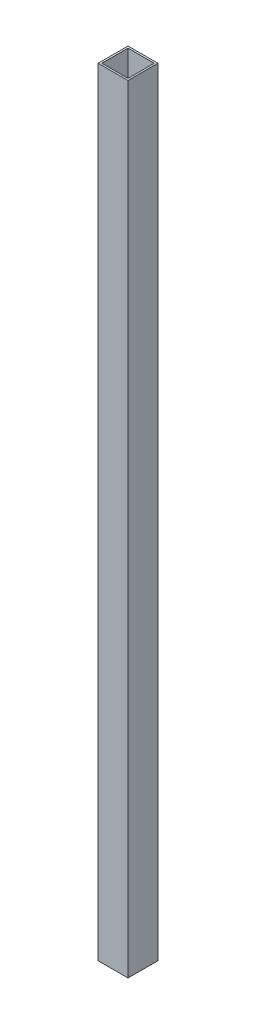
ISO-10303-21;
HEADER;
FILE_DESCRIPTION(('STEP AP214'),'2;1');
FILE_NAME('part.step','',(''),(''),'','','');
FILE_SCHEMA(('AUTOMOTIVE_DESIGN { 1 0 10303 214 1 1 1 1 }'));
ENDSEC;
DATA;
#1=APPLICATION_CONTEXT('core data for automotive mechanical design processes');
#2=APPLICATION_PROTOCOL_DEFINITION('international standard','automotive_design',2000,#1);
#3=PRODUCT_CONTEXT('',#1,'mechanical');
#4=PRODUCT('Part','Part','',(#3));
#5=PRODUCT_RELATED_PRODUCT_CATEGORY('part','',(#4));
#6=PRODUCT_DEFINITION_FORMATION('','',#4);
#7=PRODUCT_DEFINITION_CONTEXT('part definition',#1,'design');
#8=PRODUCT_DEFINITION('design','',#6,#7);
#9=PRODUCT_DEFINITION_SHAPE('','',#8);
#10=(LENGTH_UNIT() NAMED_UNIT(*) SI_UNIT(.MILLI.,.METRE.));
#11=(NAMED_UNIT(*) PLANE_ANGLE_UNIT() SI_UNIT($,.RADIAN.));
#12=(NAMED_UNIT(*) SI_UNIT($,.STERADIAN.) SOLID_ANGLE_UNIT());
#13=UNCERTAINTY_MEASURE_WITH_UNIT(LENGTH_MEASURE(1.E-05),#10,'distance_accuracy_value','');
#14=(GEOMETRIC_REPRESENTATION_CONTEXT(3) GLOBAL_UNCERTAINTY_ASSIGNED_CONTEXT((#13)) GLOBAL_UNIT_ASSIGNED_CONTEXT((#10,
#11,#12)) REPRESENTATION_CONTEXT('',''));
#15=CARTESIAN_POINT('',(0.,0.,0.));
#16=DIRECTION('',(0.,0.,1.));
#17=DIRECTION('',(1.,0.,0.));
#18=AXIS2_PLACEMENT_3D('',#15,#16,#17);
#19=CARTESIAN_POINT('',(0.,660.4,0.));
#20=DIRECTION('',(0.,1.,0.));
#21=DIRECTION('',(0.,0.,1.));
#22=AXIS2_PLACEMENT_3D('',#19,#20,#21);
#23=PLANE('',#22);
#24=DIRECTION('',(0.,0.,1.));
#25=VECTOR('',#24,1.);
#26=CARTESIAN_POINT('',(-12.7,660.4,12.7));
#27=LINE('',#26,#25);
#28=CARTESIAN_POINT('',(-12.7,660.4,-12.7));
#29=VERTEX_POINT('',#28);
#30=CARTESIAN_POINT('',(-12.7,660.4,12.7));
#31=VERTEX_POINT('',#30);
#32=EDGE_CURVE('E134',#29,#31,#27,.T.);
#33=ORIENTED_EDGE('',*,*,#32,.T.);
#34=DIRECTION('',(1.,0.,0.));
#35=VECTOR('',#34,1.);
#36=CARTESIAN_POINT('',(12.7,660.4,12.7));
#37=LINE('',#36,#35);
#38=CARTESIAN_POINT('',(12.7,660.4,12.7));
#39=VERTEX_POINT('',#38);
#40=EDGE_CURVE('E137',#31,#39,#37,.T.);
#41=ORIENTED_EDGE('',*,*,#40,.T.);
#42=DIRECTION('',(0.,0.,-1.));
#43=VECTOR('',#42,1.);
#44=CARTESIAN_POINT('',(12.7,660.4,12.7));
#45=LINE('',#44,#43);
#46=CARTESIAN_POINT('',(12.7,660.4,-12.7));
#47=VERTEX_POINT('',#46);
#48=EDGE_CURVE('E140',#39,#47,#45,.T.);
#49=ORIENTED_EDGE('',*,*,#48,.T.);
#50=DIRECTION('',(-1.,0.,0.));
#51=VECTOR('',#50,1.);
#52=CARTESIAN_POINT('',(12.7,660.4,-12.7));
#53=LINE('',#52,#51);
#54=EDGE_CURVE('E142',#47,#29,#53,.T.);
#55=ORIENTED_EDGE('',*,*,#54,.T.);
#56=EDGE_LOOP('',(#33,#41,#49,#55));
#57=FACE_BOUND('',#56,.T.);
#58=DIRECTION('',(1.,0.,0.));
#59=VECTOR('',#58,1.);
#60=CARTESIAN_POINT('',(11.1125,660.4,11.1125));
#61=LINE('',#60,#59);
#62=CARTESIAN_POINT('',(-11.1125,660.4,11.1125));
#63=VERTEX_POINT('',#62);
#64=CARTESIAN_POINT('',(11.1125,660.4,11.1125));
#65=VERTEX_POINT('',#64);
#66=EDGE_CURVE('E106',#63,#65,#61,.T.);
#67=ORIENTED_EDGE('',*,*,#66,.F.);
#68=DIRECTION('',(0.,0.,1.));
#69=VECTOR('',#68,1.);
#70=CARTESIAN_POINT('',(-11.1125,660.4,11.1125));
#71=LINE('',#70,#69);
#72=CARTESIAN_POINT('',(-11.1125,660.4,-11.1125));
#73=VERTEX_POINT('',#72);
#74=EDGE_CURVE('E98',#73,#63,#71,.T.);
#75=ORIENTED_EDGE('',*,*,#74,.F.);
#76=DIRECTION('',(-1.,0.,0.));
#77=VECTOR('',#76,1.);
#78=CARTESIAN_POINT('',(11.1125,660.4,-11.1125));
#79=LINE('',#78,#77);
#80=CARTESIAN_POINT('',(11.1125,660.4,-11.1125));
#81=VERTEX_POINT('',#80);
#82=EDGE_CURVE('E120',#81,#73,#79,.T.);
#83=ORIENTED_EDGE('',*,*,#82,.F.);
#84=DIRECTION('',(0.,0.,-1.));
#85=VECTOR('',#84,1.);
#86=CARTESIAN_POINT('',(11.1125,660.4,11.1125));
#87=LINE('',#86,#85);
#88=EDGE_CURVE('E118',#65,#81,#87,.T.);
#89=ORIENTED_EDGE('',*,*,#88,.F.);
#90=EDGE_LOOP('',(#67,#75,#83,#89));
#91=FACE_BOUND('',#90,.T.);
#92=ADVANCED_FACE('F33',(#57,#91),#23,.T.);
#93=CARTESIAN_POINT('',(0.,0.,0.));
#94=DIRECTION('',(0.,1.,0.));
#95=DIRECTION('',(0.,0.,1.));
#96=AXIS2_PLACEMENT_3D('',#93,#94,#95);
#97=PLANE('',#96);
#98=DIRECTION('',(0.,0.,1.));
#99=VECTOR('',#98,1.);
#100=CARTESIAN_POINT('',(-12.7,0.,12.7));
#101=LINE('',#100,#99);
#102=CARTESIAN_POINT('',(-12.7,0.,-12.7));
#103=VERTEX_POINT('',#102);
#104=CARTESIAN_POINT('',(-12.7,0.,12.7));
#105=VERTEX_POINT('',#104);
#106=EDGE_CURVE('E114',#103,#105,#101,.T.);
#107=ORIENTED_EDGE('',*,*,#106,.F.);
#108=DIRECTION('',(-1.,0.,0.));
#109=VECTOR('',#108,1.);
#110=CARTESIAN_POINT('',(12.7,0.,-12.7));
#111=LINE('',#110,#109);
#112=CARTESIAN_POINT('',(12.7,0.,-12.7));
#113=VERTEX_POINT('',#112);
#114=EDGE_CURVE('E138',#113,#103,#111,.T.);
#115=ORIENTED_EDGE('',*,*,#114,.F.);
#116=DIRECTION('',(0.,0.,-1.));
#117=VECTOR('',#116,1.);
#118=CARTESIAN_POINT('',(12.7,0.,12.7));
#119=LINE('',#118,#117);
#120=CARTESIAN_POINT('',(12.7,0.,12.7));
#121=VERTEX_POINT('',#120);
#122=EDGE_CURVE('E149',#121,#113,#119,.T.);
#123=ORIENTED_EDGE('',*,*,#122,.F.);
#124=DIRECTION('',(1.,0.,0.));
#125=VECTOR('',#124,1.);
#126=CARTESIAN_POINT('',(12.7,0.,12.7));
#127=LINE('',#126,#125);
#128=EDGE_CURVE('E147',#105,#121,#127,.T.);
#129=ORIENTED_EDGE('',*,*,#128,.F.);
#130=EDGE_LOOP('',(#107,#115,#123,#129));
#131=FACE_BOUND('',#130,.T.);
#132=DIRECTION('',(0.,0.,1.));
#133=VECTOR('',#132,1.);
#134=CARTESIAN_POINT('',(-11.1125,0.,11.1125));
#135=LINE('',#134,#133);
#136=CARTESIAN_POINT('',(-11.1125,0.,-11.1125));
#137=VERTEX_POINT('',#136);
#138=CARTESIAN_POINT('',(-11.1125,0.,11.1125));
#139=VERTEX_POINT('',#138);
#140=EDGE_CURVE('E56',#137,#139,#135,.T.);
#141=ORIENTED_EDGE('',*,*,#140,.T.);
#142=DIRECTION('',(1.,0.,0.));
#143=VECTOR('',#142,1.);
#144=CARTESIAN_POINT('',(11.1125,0.,11.1125));
#145=LINE('',#144,#143);
#146=CARTESIAN_POINT('',(11.1125,0.,11.1125));
#147=VERTEX_POINT('',#146);
#148=EDGE_CURVE('E113',#139,#147,#145,.T.);
#149=ORIENTED_EDGE('',*,*,#148,.T.);
#150=DIRECTION('',(0.,0.,-1.));
#151=VECTOR('',#150,1.);
#152=CARTESIAN_POINT('',(11.1125,0.,11.1125));
#153=LINE('',#152,#151);
#154=CARTESIAN_POINT('',(11.1125,0.,-11.1125));
#155=VERTEX_POINT('',#154);
#156=EDGE_CURVE('E126',#147,#155,#153,.T.);
#157=ORIENTED_EDGE('',*,*,#156,.T.);
#158=DIRECTION('',(-1.,0.,0.));
#159=VECTOR('',#158,1.);
#160=CARTESIAN_POINT('',(11.1125,0.,-11.1125));
#161=LINE('',#160,#159);
#162=EDGE_CURVE('E107',#155,#137,#161,.T.);
#163=ORIENTED_EDGE('',*,*,#162,.T.);
#164=EDGE_LOOP('',(#141,#149,#157,#163));
#165=FACE_BOUND('',#164,.T.);
#166=ADVANCED_FACE('F167',(#131,#165),#97,.F.);
#167=CARTESIAN_POINT('',(-12.7,660.4,12.7));
#168=DIRECTION('',(1.,0.,0.));
#169=DIRECTION('',(0.,0.,-1.));
#170=AXIS2_PLACEMENT_3D('',#167,#168,#169);
#171=PLANE('',#170);
#172=ORIENTED_EDGE('',*,*,#106,.T.);
#173=DIRECTION('',(0.,-1.,0.));
#174=VECTOR('',#173,1.);
#175=CARTESIAN_POINT('',(-12.7,660.4,12.7));
#176=LINE('',#175,#174);
#177=EDGE_CURVE('E11',#31,#105,#176,.T.);
#178=ORIENTED_EDGE('',*,*,#177,.F.);
#179=ORIENTED_EDGE('',*,*,#32,.F.);
#180=DIRECTION('',(0.,-1.,0.));
#181=VECTOR('',#180,1.);
#182=CARTESIAN_POINT('',(-12.7,660.4,-12.7));
#183=LINE('',#182,#181);
#184=EDGE_CURVE('E144',#29,#103,#183,.T.);
#185=ORIENTED_EDGE('',*,*,#184,.T.);
#186=EDGE_LOOP('',(#172,#178,#179,#185));
#187=FACE_BOUND('',#186,.T.);
#188=ADVANCED_FACE('F35',(#187),#171,.F.);
#189=CARTESIAN_POINT('',(12.7,660.4,12.7));
#190=DIRECTION('',(0.,0.,-1.));
#191=DIRECTION('',(-1.,0.,0.));
#192=AXIS2_PLACEMENT_3D('',#189,#190,#191);
#193=PLANE('',#192);
#194=ORIENTED_EDGE('',*,*,#128,.T.);
#195=DIRECTION('',(0.,-1.,0.));
#196=VECTOR('',#195,1.);
#197=CARTESIAN_POINT('',(12.7,660.4,12.7));
#198=LINE('',#197,#196);
#199=EDGE_CURVE('E41',#39,#121,#198,.T.);
#200=ORIENTED_EDGE('',*,*,#199,.F.);
#201=ORIENTED_EDGE('',*,*,#40,.F.);
#202=ORIENTED_EDGE('',*,*,#177,.T.);
#203=EDGE_LOOP('',(#194,#200,#201,#202));
#204=FACE_BOUND('',#203,.T.);
#205=ADVANCED_FACE('F177',(#204),#193,.F.);
#206=CARTESIAN_POINT('',(12.7,660.4,12.7));
#207=DIRECTION('',(-1.,0.,0.));
#208=DIRECTION('',(0.,0.,1.));
#209=AXIS2_PLACEMENT_3D('',#206,#207,#208);
#210=PLANE('',#209);
#211=ORIENTED_EDGE('',*,*,#122,.T.);
#212=DIRECTION('',(0.,-1.,0.));
#213=VECTOR('',#212,1.);
#214=CARTESIAN_POINT('',(12.7,660.4,-12.7));
#215=LINE('',#214,#213);
#216=EDGE_CURVE('E154',#47,#113,#215,.T.);
#217=ORIENTED_EDGE('',*,*,#216,.F.);
#218=ORIENTED_EDGE('',*,*,#48,.F.);
#219=ORIENTED_EDGE('',*,*,#199,.T.);
#220=EDGE_LOOP('',(#211,#217,#218,#219));
#221=FACE_BOUND('',#220,.T.);
#222=ADVANCED_FACE('F161',(#221),#210,.F.);
#223=CARTESIAN_POINT('',(12.7,660.4,-12.7));
#224=DIRECTION('',(0.,0.,1.));
#225=DIRECTION('',(1.,0.,0.));
#226=AXIS2_PLACEMENT_3D('',#223,#224,#225);
#227=PLANE('',#226);
#228=ORIENTED_EDGE('',*,*,#114,.T.);
#229=ORIENTED_EDGE('',*,*,#184,.F.);
#230=ORIENTED_EDGE('',*,*,#54,.F.);
#231=ORIENTED_EDGE('',*,*,#216,.T.);
#232=EDGE_LOOP('',(#228,#229,#230,#231));
#233=FACE_BOUND('',#232,.T.);
#234=ADVANCED_FACE('F171',(#233),#227,.F.);
#235=CARTESIAN_POINT('',(-11.1125,660.4,11.1125));
#236=DIRECTION('',(1.,0.,0.));
#237=DIRECTION('',(0.,0.,-1.));
#238=AXIS2_PLACEMENT_3D('',#235,#236,#237);
#239=PLANE('',#238);
#240=ORIENTED_EDGE('',*,*,#140,.F.);
#241=DIRECTION('',(0.,-1.,0.));
#242=VECTOR('',#241,1.);
#243=CARTESIAN_POINT('',(-11.1125,660.4,-11.1125));
#244=LINE('',#243,#242);
#245=EDGE_CURVE('E102',#73,#137,#244,.T.);
#246=ORIENTED_EDGE('',*,*,#245,.F.);
#247=ORIENTED_EDGE('',*,*,#74,.T.);
#248=DIRECTION('',(0.,-1.,0.));
#249=VECTOR('',#248,1.);
#250=CARTESIAN_POINT('',(-11.1125,660.4,11.1125));
#251=LINE('',#250,#249);
#252=EDGE_CURVE('E101',#63,#139,#251,.T.);
#253=ORIENTED_EDGE('',*,*,#252,.T.);
#254=EDGE_LOOP('',(#240,#246,#247,#253));
#255=FACE_BOUND('',#254,.T.);
#256=ADVANCED_FACE('F100',(#255),#239,.T.);
#257=CARTESIAN_POINT('',(11.1125,660.4,11.1125));
#258=DIRECTION('',(0.,0.,-1.));
#259=DIRECTION('',(-1.,0.,0.));
#260=AXIS2_PLACEMENT_3D('',#257,#258,#259);
#261=PLANE('',#260);
#262=ORIENTED_EDGE('',*,*,#148,.F.);
#263=ORIENTED_EDGE('',*,*,#252,.F.);
#264=ORIENTED_EDGE('',*,*,#66,.T.);
#265=DIRECTION('',(0.,-1.,0.));
#266=VECTOR('',#265,1.);
#267=CARTESIAN_POINT('',(11.1125,660.4,11.1125));
#268=LINE('',#267,#266);
#269=EDGE_CURVE('E115',#65,#147,#268,.T.);
#270=ORIENTED_EDGE('',*,*,#269,.T.);
#271=EDGE_LOOP('',(#262,#263,#264,#270));
#272=FACE_BOUND('',#271,.T.);
#273=ADVANCED_FACE('F110',(#272),#261,.T.);
#274=CARTESIAN_POINT('',(11.1125,660.4,11.1125));
#275=DIRECTION('',(-1.,0.,0.));
#276=DIRECTION('',(0.,0.,1.));
#277=AXIS2_PLACEMENT_3D('',#274,#275,#276);
#278=PLANE('',#277);
#279=ORIENTED_EDGE('',*,*,#156,.F.);
#280=ORIENTED_EDGE('',*,*,#269,.F.);
#281=ORIENTED_EDGE('',*,*,#88,.T.);
#282=DIRECTION('',(0.,-1.,0.));
#283=VECTOR('',#282,1.);
#284=CARTESIAN_POINT('',(11.1125,660.4,-11.1125));
#285=LINE('',#284,#283);
#286=EDGE_CURVE('E48',#81,#155,#285,.T.);
#287=ORIENTED_EDGE('',*,*,#286,.T.);
#288=EDGE_LOOP('',(#279,#280,#281,#287));
#289=FACE_BOUND('',#288,.T.);
#290=ADVANCED_FACE('F200',(#289),#278,.T.);
#291=CARTESIAN_POINT('',(11.1125,660.4,-11.1125));
#292=DIRECTION('',(0.,0.,1.));
#293=DIRECTION('',(1.,0.,0.));
#294=AXIS2_PLACEMENT_3D('',#291,#292,#293);
#295=PLANE('',#294);
#296=ORIENTED_EDGE('',*,*,#162,.F.);
#297=ORIENTED_EDGE('',*,*,#286,.F.);
#298=ORIENTED_EDGE('',*,*,#82,.T.);
#299=ORIENTED_EDGE('',*,*,#245,.T.);
#300=EDGE_LOOP('',(#296,#297,#298,#299));
#301=FACE_BOUND('',#300,.T.);
#302=ADVANCED_FACE('F204',(#301),#295,.T.);
#303=CLOSED_SHELL('',(#92,#166,#188,#205,#222,#234,#256,#273,#290,#302));
#304=MANIFOLD_SOLID_BREP('B2',#303);
#305=ADVANCED_BREP_SHAPE_REPRESENTATION('',(#18,#304),#14);
#306=SHAPE_DEFINITION_REPRESENTATION(#9,#305);
ENDSEC;
END-ISO-10303-21;
